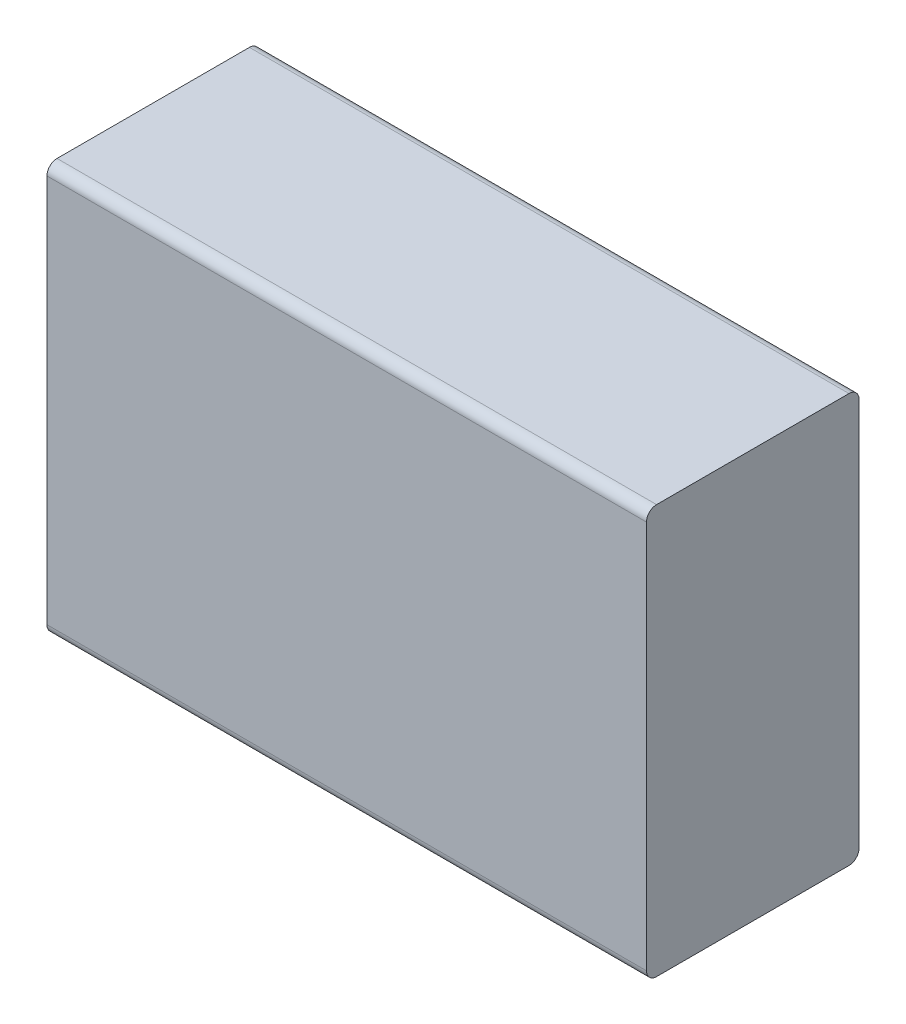
ISO-10303-21;
HEADER;
FILE_DESCRIPTION(('STEP AP214'),'2;1');
FILE_NAME('part.step','',(''),(''),'','','');
FILE_SCHEMA(('AUTOMOTIVE_DESIGN { 1 0 10303 214 1 1 1 1 }'));
ENDSEC;
DATA;
#1=APPLICATION_CONTEXT('core data for automotive mechanical design processes');
#2=APPLICATION_PROTOCOL_DEFINITION('international standard','automotive_design',2000,#1);
#3=PRODUCT_CONTEXT('',#1,'mechanical');
#4=PRODUCT('Part','Part','',(#3));
#5=PRODUCT_RELATED_PRODUCT_CATEGORY('part','',(#4));
#6=PRODUCT_DEFINITION_FORMATION('','',#4);
#7=PRODUCT_DEFINITION_CONTEXT('part definition',#1,'design');
#8=PRODUCT_DEFINITION('design','',#6,#7);
#9=PRODUCT_DEFINITION_SHAPE('','',#8);
#10=(LENGTH_UNIT() NAMED_UNIT(*) SI_UNIT(.MILLI.,.METRE.));
#11=(NAMED_UNIT(*) PLANE_ANGLE_UNIT() SI_UNIT($,.RADIAN.));
#12=(NAMED_UNIT(*) SI_UNIT($,.STERADIAN.) SOLID_ANGLE_UNIT());
#13=UNCERTAINTY_MEASURE_WITH_UNIT(LENGTH_MEASURE(1.E-05),#10,'distance_accuracy_value','');
#14=(GEOMETRIC_REPRESENTATION_CONTEXT(3) GLOBAL_UNCERTAINTY_ASSIGNED_CONTEXT((#13)) GLOBAL_UNIT_ASSIGNED_CONTEXT((#10,
#11,#12)) REPRESENTATION_CONTEXT('',''));
#15=CARTESIAN_POINT('',(0.,0.,0.));
#16=DIRECTION('',(0.,0.,1.));
#17=DIRECTION('',(1.,0.,0.));
#18=AXIS2_PLACEMENT_3D('',#15,#16,#17);
#19=CARTESIAN_POINT('',(1.1,-0.75,0.05));
#20=DIRECTION('',(1.,0.,0.));
#21=DIRECTION('',(0.,1.,0.));
#22=AXIS2_PLACEMENT_3D('',#19,#20,#21);
#23=PLANE('',#22);
#24=DIRECTION('',(0.,0.,1.));
#25=VECTOR('',#24,1.);
#26=CARTESIAN_POINT('',(1.1,-0.75,0.05));
#27=LINE('',#26,#25);
#28=CARTESIAN_POINT('',(1.1,-0.75,0.087));
#29=VERTEX_POINT('',#28);
#30=CARTESIAN_POINT('',(1.1,-0.75,0.793));
#31=VERTEX_POINT('',#30);
#32=EDGE_CURVE('E179',#29,#31,#27,.T.);
#33=ORIENTED_EDGE('',*,*,#32,.F.);
#34=CARTESIAN_POINT('',(1.1,-0.713,0.087));
#35=DIRECTION('',(1.,0.,0.));
#36=DIRECTION('',(0.,0.,1.));
#37=AXIS2_PLACEMENT_3D('',#34,#35,#36);
#38=CIRCLE('',#37,0.037);
#39=CARTESIAN_POINT('',(1.1,-0.713,0.05));
#40=VERTEX_POINT('',#39);
#41=EDGE_CURVE('E168',#29,#40,#38,.T.);
#42=ORIENTED_EDGE('',*,*,#41,.T.);
#43=DIRECTION('',(0.,1.,0.));
#44=VECTOR('',#43,1.);
#45=CARTESIAN_POINT('',(1.1,-0.75,0.05));
#46=LINE('',#45,#44);
#47=CARTESIAN_POINT('',(1.1,0.713,0.05));
#48=VERTEX_POINT('',#47);
#49=EDGE_CURVE('E134',#40,#48,#46,.T.);
#50=ORIENTED_EDGE('',*,*,#49,.T.);
#51=CARTESIAN_POINT('',(1.1,0.713,0.087));
#52=DIRECTION('',(-1.,0.,0.));
#53=DIRECTION('',(0.,0.,1.));
#54=AXIS2_PLACEMENT_3D('',#51,#52,#53);
#55=CIRCLE('',#54,0.037);
#56=CARTESIAN_POINT('',(1.1,0.75,0.087));
#57=VERTEX_POINT('',#56);
#58=EDGE_CURVE('E87',#57,#48,#55,.T.);
#59=ORIENTED_EDGE('',*,*,#58,.F.);
#60=DIRECTION('',(0.,0.,1.));
#61=VECTOR('',#60,1.);
#62=CARTESIAN_POINT('',(1.1,0.75,0.05));
#63=LINE('',#62,#61);
#64=CARTESIAN_POINT('',(1.1,0.75,0.793));
#65=VERTEX_POINT('',#64);
#66=EDGE_CURVE('E11',#57,#65,#63,.T.);
#67=ORIENTED_EDGE('',*,*,#66,.T.);
#68=CARTESIAN_POINT('',(1.1,0.713,0.793));
#69=DIRECTION('',(1.,0.,0.));
#70=DIRECTION('',(0.,0.,1.));
#71=AXIS2_PLACEMENT_3D('',#68,#69,#70);
#72=CIRCLE('',#71,0.037);
#73=CARTESIAN_POINT('',(1.1,0.713,0.83));
#74=VERTEX_POINT('',#73);
#75=EDGE_CURVE('E195',#65,#74,#72,.T.);
#76=ORIENTED_EDGE('',*,*,#75,.T.);
#77=DIRECTION('',(0.,1.,0.));
#78=VECTOR('',#77,1.);
#79=CARTESIAN_POINT('',(1.1,-0.75,0.83));
#80=LINE('',#79,#78);
#81=CARTESIAN_POINT('',(1.1,-0.713,0.83));
#82=VERTEX_POINT('',#81);
#83=EDGE_CURVE('E76',#82,#74,#80,.T.);
#84=ORIENTED_EDGE('',*,*,#83,.F.);
#85=CARTESIAN_POINT('',(1.1,-0.713,0.793));
#86=DIRECTION('',(-1.,0.,0.));
#87=DIRECTION('',(0.,0.,1.));
#88=AXIS2_PLACEMENT_3D('',#85,#86,#87);
#89=CIRCLE('',#88,0.037);
#90=EDGE_CURVE('E172',#31,#82,#89,.T.);
#91=ORIENTED_EDGE('',*,*,#90,.F.);
#92=EDGE_LOOP('',(#33,#42,#50,#59,#67,#76,#84,#91));
#93=FACE_BOUND('',#92,.T.);
#94=ADVANCED_FACE('F17',(#93),#23,.T.);
#95=CARTESIAN_POINT('',(-1.1,0.75,0.05));
#96=DIRECTION('',(0.,1.,0.));
#97=DIRECTION('',(1.,0.,0.));
#98=AXIS2_PLACEMENT_3D('',#95,#96,#97);
#99=PLANE('',#98);
#100=ORIENTED_EDGE('',*,*,#66,.F.);
#101=DIRECTION('',(1.,0.,0.));
#102=VECTOR('',#101,1.);
#103=CARTESIAN_POINT('',(-1.1,0.75,0.087));
#104=LINE('',#103,#102);
#105=CARTESIAN_POINT('',(-1.1,0.75,0.087));
#106=VERTEX_POINT('',#105);
#107=EDGE_CURVE('E190',#106,#57,#104,.T.);
#108=ORIENTED_EDGE('',*,*,#107,.F.);
#109=DIRECTION('',(0.,0.,1.));
#110=VECTOR('',#109,1.);
#111=CARTESIAN_POINT('',(-1.1,0.75,0.05));
#112=LINE('',#111,#110);
#113=CARTESIAN_POINT('',(-1.1,0.75,0.793));
#114=VERTEX_POINT('',#113);
#115=EDGE_CURVE('E151',#106,#114,#112,.T.);
#116=ORIENTED_EDGE('',*,*,#115,.T.);
#117=DIRECTION('',(1.,0.,0.));
#118=VECTOR('',#117,1.);
#119=CARTESIAN_POINT('',(-1.1,0.75,0.793));
#120=LINE('',#119,#118);
#121=EDGE_CURVE('E26',#114,#65,#120,.T.);
#122=ORIENTED_EDGE('',*,*,#121,.T.);
#123=EDGE_LOOP('',(#100,#108,#116,#122));
#124=FACE_BOUND('',#123,.T.);
#125=ADVANCED_FACE('F19',(#124),#99,.T.);
#126=CARTESIAN_POINT('',(-1.1,0.713,0.793));
#127=DIRECTION('',(1.,0.,0.));
#128=DIRECTION('',(0.,1.,0.));
#129=AXIS2_PLACEMENT_3D('',#126,#127,#128);
#130=CYLINDRICAL_SURFACE('',#129,0.037);
#131=CARTESIAN_POINT('',(-1.1,0.713,0.793));
#132=DIRECTION('',(1.,0.,0.));
#133=DIRECTION('',(0.,0.,1.));
#134=AXIS2_PLACEMENT_3D('',#131,#132,#133);
#135=CIRCLE('',#134,0.037);
#136=CARTESIAN_POINT('',(-1.1,0.713,0.83));
#137=VERTEX_POINT('',#136);
#138=EDGE_CURVE('E158',#114,#137,#135,.T.);
#139=ORIENTED_EDGE('',*,*,#138,.T.);
#140=DIRECTION('',(1.,0.,0.));
#141=VECTOR('',#140,1.);
#142=CARTESIAN_POINT('',(-1.1,0.713,0.83));
#143=LINE('',#142,#141);
#144=EDGE_CURVE('E98',#137,#74,#143,.T.);
#145=ORIENTED_EDGE('',*,*,#144,.T.);
#146=ORIENTED_EDGE('',*,*,#75,.F.);
#147=ORIENTED_EDGE('',*,*,#121,.F.);
#148=EDGE_LOOP('',(#139,#145,#146,#147));
#149=FACE_BOUND('',#148,.T.);
#150=ADVANCED_FACE('F202',(#149),#130,.T.);
#151=CARTESIAN_POINT('',(-1.1,0.713,0.087));
#152=DIRECTION('',(1.,0.,0.));
#153=DIRECTION('',(0.,1.,0.));
#154=AXIS2_PLACEMENT_3D('',#151,#152,#153);
#155=CYLINDRICAL_SURFACE('',#154,0.037);
#156=ORIENTED_EDGE('',*,*,#107,.T.);
#157=ORIENTED_EDGE('',*,*,#58,.T.);
#158=DIRECTION('',(1.,0.,0.));
#159=VECTOR('',#158,1.);
#160=CARTESIAN_POINT('',(-1.1,0.713,0.05));
#161=LINE('',#160,#159);
#162=CARTESIAN_POINT('',(-1.1,0.713,0.05));
#163=VERTEX_POINT('',#162);
#164=EDGE_CURVE('E126',#163,#48,#161,.T.);
#165=ORIENTED_EDGE('',*,*,#164,.F.);
#166=CARTESIAN_POINT('',(-1.1,0.713,0.087));
#167=DIRECTION('',(-1.,0.,0.));
#168=DIRECTION('',(0.,0.,1.));
#169=AXIS2_PLACEMENT_3D('',#166,#167,#168);
#170=CIRCLE('',#169,0.037);
#171=EDGE_CURVE('E130',#106,#163,#170,.T.);
#172=ORIENTED_EDGE('',*,*,#171,.F.);
#173=EDGE_LOOP('',(#156,#157,#165,#172));
#174=FACE_BOUND('',#173,.T.);
#175=ADVANCED_FACE('F128',(#174),#155,.T.);
#176=CARTESIAN_POINT('',(-1.1,-0.75,0.83));
#177=DIRECTION('',(0.,0.,1.));
#178=DIRECTION('',(1.,0.,0.));
#179=AXIS2_PLACEMENT_3D('',#176,#177,#178);
#180=PLANE('',#179);
#181=DIRECTION('',(0.,1.,0.));
#182=VECTOR('',#181,1.);
#183=CARTESIAN_POINT('',(-1.1,-0.75,0.83));
#184=LINE('',#183,#182);
#185=CARTESIAN_POINT('',(-1.1,-0.713,0.83));
#186=VERTEX_POINT('',#185);
#187=EDGE_CURVE('E346',#186,#137,#184,.T.);
#188=ORIENTED_EDGE('',*,*,#187,.F.);
#189=DIRECTION('',(1.,0.,0.));
#190=VECTOR('',#189,1.);
#191=CARTESIAN_POINT('',(-1.1,-0.713,0.83));
#192=LINE('',#191,#190);
#193=EDGE_CURVE('E108',#186,#82,#192,.T.);
#194=ORIENTED_EDGE('',*,*,#193,.T.);
#195=ORIENTED_EDGE('',*,*,#83,.T.);
#196=ORIENTED_EDGE('',*,*,#144,.F.);
#197=EDGE_LOOP('',(#188,#194,#195,#196));
#198=FACE_BOUND('',#197,.T.);
#199=ADVANCED_FACE('F220',(#198),#180,.T.);
#200=CARTESIAN_POINT('',(-1.1,-0.75,0.05));
#201=DIRECTION('',(0.,0.,1.));
#202=DIRECTION('',(1.,0.,0.));
#203=AXIS2_PLACEMENT_3D('',#200,#201,#202);
#204=PLANE('',#203);
#205=ORIENTED_EDGE('',*,*,#164,.T.);
#206=ORIENTED_EDGE('',*,*,#49,.F.);
#207=DIRECTION('',(1.,0.,0.));
#208=VECTOR('',#207,1.);
#209=CARTESIAN_POINT('',(-1.1,-0.713,0.05));
#210=LINE('',#209,#208);
#211=CARTESIAN_POINT('',(-1.1,-0.713,0.05));
#212=VERTEX_POINT('',#211);
#213=EDGE_CURVE('E140',#212,#40,#210,.T.);
#214=ORIENTED_EDGE('',*,*,#213,.F.);
#215=DIRECTION('',(0.,1.,0.));
#216=VECTOR('',#215,1.);
#217=CARTESIAN_POINT('',(-1.1,-0.75,0.05));
#218=LINE('',#217,#216);
#219=EDGE_CURVE('E137',#212,#163,#218,.T.);
#220=ORIENTED_EDGE('',*,*,#219,.T.);
#221=EDGE_LOOP('',(#205,#206,#214,#220));
#222=FACE_BOUND('',#221,.T.);
#223=ADVANCED_FACE('F138',(#222),#204,.F.);
#224=CARTESIAN_POINT('',(-1.1,-0.713,0.793));
#225=DIRECTION('',(1.,0.,0.));
#226=DIRECTION('',(0.,-1.,0.));
#227=AXIS2_PLACEMENT_3D('',#224,#225,#226);
#228=CYLINDRICAL_SURFACE('',#227,0.037);
#229=DIRECTION('',(1.,0.,0.));
#230=VECTOR('',#229,1.);
#231=CARTESIAN_POINT('',(-1.1,-0.75,0.793));
#232=LINE('',#231,#230);
#233=CARTESIAN_POINT('',(-1.1,-0.75,0.793));
#234=VERTEX_POINT('',#233);
#235=EDGE_CURVE('E119',#234,#31,#232,.T.);
#236=ORIENTED_EDGE('',*,*,#235,.T.);
#237=ORIENTED_EDGE('',*,*,#90,.T.);
#238=ORIENTED_EDGE('',*,*,#193,.F.);
#239=CARTESIAN_POINT('',(-1.1,-0.713,0.793));
#240=DIRECTION('',(-1.,0.,0.));
#241=DIRECTION('',(0.,0.,1.));
#242=AXIS2_PLACEMENT_3D('',#239,#240,#241);
#243=CIRCLE('',#242,0.037);
#244=EDGE_CURVE('E351',#234,#186,#243,.T.);
#245=ORIENTED_EDGE('',*,*,#244,.F.);
#246=EDGE_LOOP('',(#236,#237,#238,#245));
#247=FACE_BOUND('',#246,.T.);
#248=ADVANCED_FACE('F215',(#247),#228,.T.);
#249=CARTESIAN_POINT('',(-1.1,-0.713,0.087));
#250=DIRECTION('',(1.,0.,0.));
#251=DIRECTION('',(0.,-1.,0.));
#252=AXIS2_PLACEMENT_3D('',#249,#250,#251);
#253=CYLINDRICAL_SURFACE('',#252,0.037);
#254=CARTESIAN_POINT('',(-1.1,-0.713,0.087));
#255=DIRECTION('',(1.,0.,0.));
#256=DIRECTION('',(0.,0.,1.));
#257=AXIS2_PLACEMENT_3D('',#254,#255,#256);
#258=CIRCLE('',#257,0.037);
#259=CARTESIAN_POINT('',(-1.1,-0.75,0.087));
#260=VERTEX_POINT('',#259);
#261=EDGE_CURVE('E145',#260,#212,#258,.T.);
#262=ORIENTED_EDGE('',*,*,#261,.T.);
#263=ORIENTED_EDGE('',*,*,#213,.T.);
#264=ORIENTED_EDGE('',*,*,#41,.F.);
#265=DIRECTION('',(1.,0.,0.));
#266=VECTOR('',#265,1.);
#267=CARTESIAN_POINT('',(-1.1,-0.75,0.087));
#268=LINE('',#267,#266);
#269=EDGE_CURVE('E175',#260,#29,#268,.T.);
#270=ORIENTED_EDGE('',*,*,#269,.F.);
#271=EDGE_LOOP('',(#262,#263,#264,#270));
#272=FACE_BOUND('',#271,.T.);
#273=ADVANCED_FACE('F213',(#272),#253,.T.);
#274=CARTESIAN_POINT('',(-1.1,-0.75,0.05));
#275=DIRECTION('',(0.,1.,0.));
#276=DIRECTION('',(1.,0.,0.));
#277=AXIS2_PLACEMENT_3D('',#274,#275,#276);
#278=PLANE('',#277);
#279=ORIENTED_EDGE('',*,*,#235,.F.);
#280=DIRECTION('',(0.,0.,1.));
#281=VECTOR('',#280,1.);
#282=CARTESIAN_POINT('',(-1.1,-0.75,0.05));
#283=LINE('',#282,#281);
#284=EDGE_CURVE('E163',#260,#234,#283,.T.);
#285=ORIENTED_EDGE('',*,*,#284,.F.);
#286=ORIENTED_EDGE('',*,*,#269,.T.);
#287=ORIENTED_EDGE('',*,*,#32,.T.);
#288=EDGE_LOOP('',(#279,#285,#286,#287));
#289=FACE_BOUND('',#288,.T.);
#290=ADVANCED_FACE('F261',(#289),#278,.F.);
#291=CARTESIAN_POINT('',(-1.1,-0.75,0.05));
#292=DIRECTION('',(1.,0.,0.));
#293=DIRECTION('',(0.,1.,0.));
#294=AXIS2_PLACEMENT_3D('',#291,#292,#293);
#295=PLANE('',#294);
#296=ORIENTED_EDGE('',*,*,#244,.T.);
#297=ORIENTED_EDGE('',*,*,#187,.T.);
#298=ORIENTED_EDGE('',*,*,#138,.F.);
#299=ORIENTED_EDGE('',*,*,#115,.F.);
#300=ORIENTED_EDGE('',*,*,#171,.T.);
#301=ORIENTED_EDGE('',*,*,#219,.F.);
#302=ORIENTED_EDGE('',*,*,#261,.F.);
#303=ORIENTED_EDGE('',*,*,#284,.T.);
#304=EDGE_LOOP('',(#296,#297,#298,#299,#300,#301,#302,#303));
#305=FACE_BOUND('',#304,.T.);
#306=ADVANCED_FACE('F148',(#305),#295,.F.);
#307=CLOSED_SHELL('',(#94,#125,#150,#175,#199,#223,#248,#273,#290,#306));
#308=MANIFOLD_SOLID_BREP('B1',#307);
#309=ADVANCED_BREP_SHAPE_REPRESENTATION('',(#18,#308),#14);
#310=SHAPE_DEFINITION_REPRESENTATION(#9,#309);
ENDSEC;
END-ISO-10303-21;
